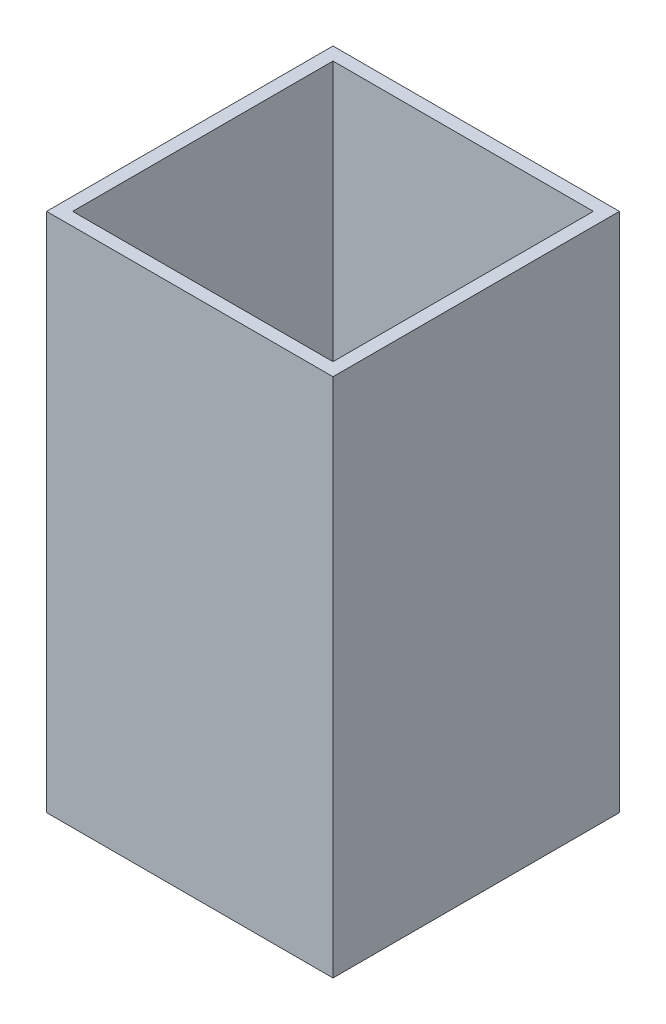
ISO-10303-21;
HEADER;
FILE_DESCRIPTION(('STEP AP214'),'2;1');
FILE_NAME('part.step','',(''),(''),'','','');
FILE_SCHEMA(('AUTOMOTIVE_DESIGN { 1 0 10303 214 1 1 1 1 }'));
ENDSEC;
DATA;
#1=APPLICATION_CONTEXT('core data for automotive mechanical design processes');
#2=APPLICATION_PROTOCOL_DEFINITION('international standard','automotive_design',2000,#1);
#3=PRODUCT_CONTEXT('',#1,'mechanical');
#4=PRODUCT('Part','Part','',(#3));
#5=PRODUCT_RELATED_PRODUCT_CATEGORY('part','',(#4));
#6=PRODUCT_DEFINITION_FORMATION('','',#4);
#7=PRODUCT_DEFINITION_CONTEXT('part definition',#1,'design');
#8=PRODUCT_DEFINITION('design','',#6,#7);
#9=PRODUCT_DEFINITION_SHAPE('','',#8);
#10=(LENGTH_UNIT() NAMED_UNIT(*) SI_UNIT(.MILLI.,.METRE.));
#11=(NAMED_UNIT(*) PLANE_ANGLE_UNIT() SI_UNIT($,.RADIAN.));
#12=(NAMED_UNIT(*) SI_UNIT($,.STERADIAN.) SOLID_ANGLE_UNIT());
#13=UNCERTAINTY_MEASURE_WITH_UNIT(LENGTH_MEASURE(1.E-05),#10,'distance_accuracy_value','');
#14=(GEOMETRIC_REPRESENTATION_CONTEXT(3) GLOBAL_UNCERTAINTY_ASSIGNED_CONTEXT((#13)) GLOBAL_UNIT_ASSIGNED_CONTEXT((#10,
#11,#12)) REPRESENTATION_CONTEXT('',''));
#15=CARTESIAN_POINT('',(0.,0.,0.));
#16=DIRECTION('',(0.,0.,1.));
#17=DIRECTION('',(1.,0.,0.));
#18=AXIS2_PLACEMENT_3D('',#15,#16,#17);
#19=CARTESIAN_POINT('',(-27.5,100.,-27.5));
#20=DIRECTION('',(1.,0.,0.));
#21=DIRECTION('',(0.,0.,-1.));
#22=AXIS2_PLACEMENT_3D('',#19,#20,#21);
#23=PLANE('',#22);
#24=DIRECTION('',(0.,0.,1.));
#25=VECTOR('',#24,1.);
#26=CARTESIAN_POINT('',(-27.5,0.,-27.5));
#27=LINE('',#26,#25);
#28=CARTESIAN_POINT('',(-27.5,0.,-27.5));
#29=VERTEX_POINT('',#28);
#30=CARTESIAN_POINT('',(-27.5,0.,27.5));
#31=VERTEX_POINT('',#30);
#32=EDGE_CURVE('E125',#29,#31,#27,.T.);
#33=ORIENTED_EDGE('',*,*,#32,.T.);
#34=DIRECTION('',(0.,-1.,0.));
#35=VECTOR('',#34,1.);
#36=CARTESIAN_POINT('',(-27.5,100.,27.5));
#37=LINE('',#36,#35);
#38=CARTESIAN_POINT('',(-27.5,100.,27.5));
#39=VERTEX_POINT('',#38);
#40=EDGE_CURVE('E156',#39,#31,#37,.T.);
#41=ORIENTED_EDGE('',*,*,#40,.F.);
#42=DIRECTION('',(0.,0.,1.));
#43=VECTOR('',#42,1.);
#44=CARTESIAN_POINT('',(-27.5,100.,-27.5));
#45=LINE('',#44,#43);
#46=CARTESIAN_POINT('',(-27.5,100.,-27.5));
#47=VERTEX_POINT('',#46);
#48=EDGE_CURVE('E128',#47,#39,#45,.T.);
#49=ORIENTED_EDGE('',*,*,#48,.F.);
#50=DIRECTION('',(0.,-1.,0.));
#51=VECTOR('',#50,1.);
#52=CARTESIAN_POINT('',(-27.5,100.,-27.5));
#53=LINE('',#52,#51);
#54=EDGE_CURVE('E140',#47,#29,#53,.T.);
#55=ORIENTED_EDGE('',*,*,#54,.T.);
#56=EDGE_LOOP('',(#33,#41,#49,#55));
#57=FACE_BOUND('',#56,.T.);
#58=ADVANCED_FACE('F35',(#57),#23,.F.);
#59=CARTESIAN_POINT('',(-27.5,100.,27.5));
#60=DIRECTION('',(0.,0.,-1.));
#61=DIRECTION('',(-1.,0.,0.));
#62=AXIS2_PLACEMENT_3D('',#59,#60,#61);
#63=PLANE('',#62);
#64=DIRECTION('',(1.,0.,0.));
#65=VECTOR('',#64,1.);
#66=CARTESIAN_POINT('',(-27.5,0.,27.5));
#67=LINE('',#66,#65);
#68=CARTESIAN_POINT('',(27.5,0.,27.5));
#69=VERTEX_POINT('',#68);
#70=EDGE_CURVE('E143',#31,#69,#67,.T.);
#71=ORIENTED_EDGE('',*,*,#70,.T.);
#72=DIRECTION('',(0.,-1.,0.));
#73=VECTOR('',#72,1.);
#74=CARTESIAN_POINT('',(27.5,100.,27.5));
#75=LINE('',#74,#73);
#76=CARTESIAN_POINT('',(27.5,100.,27.5));
#77=VERTEX_POINT('',#76);
#78=EDGE_CURVE('E154',#77,#69,#75,.T.);
#79=ORIENTED_EDGE('',*,*,#78,.F.);
#80=DIRECTION('',(1.,0.,0.));
#81=VECTOR('',#80,1.);
#82=CARTESIAN_POINT('',(-27.5,100.,27.5));
#83=LINE('',#82,#81);
#84=EDGE_CURVE('E131',#39,#77,#83,.T.);
#85=ORIENTED_EDGE('',*,*,#84,.F.);
#86=ORIENTED_EDGE('',*,*,#40,.T.);
#87=EDGE_LOOP('',(#71,#79,#85,#86));
#88=FACE_BOUND('',#87,.T.);
#89=ADVANCED_FACE('F180',(#88),#63,.F.);
#90=CARTESIAN_POINT('',(27.5,100.,-27.5));
#91=DIRECTION('',(1.,0.,0.));
#92=DIRECTION('',(0.,0.,-1.));
#93=AXIS2_PLACEMENT_3D('',#90,#91,#92);
#94=PLANE('',#93);
#95=DIRECTION('',(0.,0.,1.));
#96=VECTOR('',#95,1.);
#97=CARTESIAN_POINT('',(27.5,0.,-27.5));
#98=LINE('',#97,#96);
#99=CARTESIAN_POINT('',(27.5,0.,-27.5));
#100=VERTEX_POINT('',#99);
#101=EDGE_CURVE('E146',#100,#69,#98,.T.);
#102=ORIENTED_EDGE('',*,*,#101,.F.);
#103=DIRECTION('',(0.,-1.,0.));
#104=VECTOR('',#103,1.);
#105=CARTESIAN_POINT('',(27.5,100.,-27.5));
#106=LINE('',#105,#104);
#107=CARTESIAN_POINT('',(27.5,100.,-27.5));
#108=VERTEX_POINT('',#107);
#109=EDGE_CURVE('E152',#108,#100,#106,.T.);
#110=ORIENTED_EDGE('',*,*,#109,.F.);
#111=DIRECTION('',(0.,0.,1.));
#112=VECTOR('',#111,1.);
#113=CARTESIAN_POINT('',(27.5,100.,-27.5));
#114=LINE('',#113,#112);
#115=EDGE_CURVE('E134',#108,#77,#114,.T.);
#116=ORIENTED_EDGE('',*,*,#115,.T.);
#117=ORIENTED_EDGE('',*,*,#78,.T.);
#118=EDGE_LOOP('',(#102,#110,#116,#117));
#119=FACE_BOUND('',#118,.T.);
#120=ADVANCED_FACE('F185',(#119),#94,.T.);
#121=CARTESIAN_POINT('',(-27.5,100.,-27.5));
#122=DIRECTION('',(0.,0.,-1.));
#123=DIRECTION('',(-1.,0.,0.));
#124=AXIS2_PLACEMENT_3D('',#121,#122,#123);
#125=PLANE('',#124);
#126=DIRECTION('',(1.,0.,0.));
#127=VECTOR('',#126,1.);
#128=CARTESIAN_POINT('',(-27.5,0.,-27.5));
#129=LINE('',#128,#127);
#130=EDGE_CURVE('E132',#29,#100,#129,.T.);
#131=ORIENTED_EDGE('',*,*,#130,.F.);
#132=ORIENTED_EDGE('',*,*,#54,.F.);
#133=DIRECTION('',(1.,0.,0.));
#134=VECTOR('',#133,1.);
#135=CARTESIAN_POINT('',(-27.5,100.,-27.5));
#136=LINE('',#135,#134);
#137=EDGE_CURVE('E137',#47,#108,#136,.T.);
#138=ORIENTED_EDGE('',*,*,#137,.T.);
#139=ORIENTED_EDGE('',*,*,#109,.T.);
#140=EDGE_LOOP('',(#131,#132,#138,#139));
#141=FACE_BOUND('',#140,.T.);
#142=ADVANCED_FACE('F192',(#141),#125,.T.);
#143=CARTESIAN_POINT('',(0.,100.,0.));
#144=DIRECTION('',(0.,1.,0.));
#145=DIRECTION('',(0.,0.,1.));
#146=AXIS2_PLACEMENT_3D('',#143,#144,#145);
#147=PLANE('',#146);
#148=DIRECTION('',(0.,0.,-1.));
#149=VECTOR('',#148,1.);
#150=CARTESIAN_POINT('',(25.,100.,-25.));
#151=LINE('',#150,#149);
#152=CARTESIAN_POINT('',(25.,100.,25.));
#153=VERTEX_POINT('',#152);
#154=CARTESIAN_POINT('',(25.,100.,-25.));
#155=VERTEX_POINT('',#154);
#156=EDGE_CURVE('E49',#153,#155,#151,.T.);
#157=ORIENTED_EDGE('',*,*,#156,.F.);
#158=DIRECTION('',(1.,0.,0.));
#159=VECTOR('',#158,1.);
#160=CARTESIAN_POINT('',(-25.,100.,25.));
#161=LINE('',#160,#159);
#162=CARTESIAN_POINT('',(-25.,100.,25.));
#163=VERTEX_POINT('',#162);
#164=EDGE_CURVE('E118',#163,#153,#161,.T.);
#165=ORIENTED_EDGE('',*,*,#164,.F.);
#166=DIRECTION('',(0.,0.,1.));
#167=VECTOR('',#166,1.);
#168=CARTESIAN_POINT('',(-25.,100.,-25.));
#169=LINE('',#168,#167);
#170=CARTESIAN_POINT('',(-25.,100.,-25.));
#171=VERTEX_POINT('',#170);
#172=EDGE_CURVE('E102',#171,#163,#169,.T.);
#173=ORIENTED_EDGE('',*,*,#172,.F.);
#174=DIRECTION('',(-1.,0.,0.));
#175=VECTOR('',#174,1.);
#176=CARTESIAN_POINT('',(-25.,100.,-25.));
#177=LINE('',#176,#175);
#178=EDGE_CURVE('E111',#155,#171,#177,.T.);
#179=ORIENTED_EDGE('',*,*,#178,.F.);
#180=EDGE_LOOP('',(#157,#165,#173,#179));
#181=FACE_BOUND('',#180,.T.);
#182=ORIENTED_EDGE('',*,*,#48,.T.);
#183=ORIENTED_EDGE('',*,*,#84,.T.);
#184=ORIENTED_EDGE('',*,*,#115,.F.);
#185=ORIENTED_EDGE('',*,*,#137,.F.);
#186=EDGE_LOOP('',(#182,#183,#184,#185));
#187=FACE_BOUND('',#186,.T.);
#188=ADVANCED_FACE('F115',(#181,#187),#147,.T.);
#189=CARTESIAN_POINT('',(0.,0.,0.));
#190=DIRECTION('',(0.,1.,0.));
#191=DIRECTION('',(0.,0.,1.));
#192=AXIS2_PLACEMENT_3D('',#189,#190,#191);
#193=PLANE('',#192);
#194=DIRECTION('',(1.,0.,0.));
#195=VECTOR('',#194,1.);
#196=CARTESIAN_POINT('',(0.,0.,25.));
#197=LINE('',#196,#195);
#198=CARTESIAN_POINT('',(-25.,0.,25.));
#199=VERTEX_POINT('',#198);
#200=CARTESIAN_POINT('',(25.,0.,25.));
#201=VERTEX_POINT('',#200);
#202=EDGE_CURVE('E42',#199,#201,#197,.T.);
#203=ORIENTED_EDGE('',*,*,#202,.T.);
#204=DIRECTION('',(0.,0.,-1.));
#205=VECTOR('',#204,1.);
#206=CARTESIAN_POINT('',(25.,0.,0.));
#207=LINE('',#206,#205);
#208=CARTESIAN_POINT('',(25.,0.,-25.));
#209=VERTEX_POINT('',#208);
#210=EDGE_CURVE('E11',#201,#209,#207,.T.);
#211=ORIENTED_EDGE('',*,*,#210,.T.);
#212=DIRECTION('',(-1.,0.,0.));
#213=VECTOR('',#212,1.);
#214=CARTESIAN_POINT('',(0.,0.,-25.));
#215=LINE('',#214,#213);
#216=CARTESIAN_POINT('',(-25.,0.,-25.));
#217=VERTEX_POINT('',#216);
#218=EDGE_CURVE('E159',#209,#217,#215,.T.);
#219=ORIENTED_EDGE('',*,*,#218,.T.);
#220=DIRECTION('',(0.,0.,1.));
#221=VECTOR('',#220,1.);
#222=CARTESIAN_POINT('',(-25.,0.,0.));
#223=LINE('',#222,#221);
#224=EDGE_CURVE('E105',#217,#199,#223,.T.);
#225=ORIENTED_EDGE('',*,*,#224,.T.);
#226=EDGE_LOOP('',(#203,#211,#219,#225));
#227=FACE_BOUND('',#226,.T.);
#228=ORIENTED_EDGE('',*,*,#32,.F.);
#229=ORIENTED_EDGE('',*,*,#130,.T.);
#230=ORIENTED_EDGE('',*,*,#101,.T.);
#231=ORIENTED_EDGE('',*,*,#70,.F.);
#232=EDGE_LOOP('',(#228,#229,#230,#231));
#233=FACE_BOUND('',#232,.T.);
#234=ADVANCED_FACE('F163',(#227,#233),#193,.F.);
#235=CARTESIAN_POINT('',(25.,-1.2E-05,-25.));
#236=DIRECTION('',(1.,0.,0.));
#237=DIRECTION('',(0.,0.,-1.));
#238=AXIS2_PLACEMENT_3D('',#235,#236,#237);
#239=PLANE('',#238);
#240=DIRECTION('',(0.,1.,0.));
#241=VECTOR('',#240,1.);
#242=CARTESIAN_POINT('',(25.,-1.2E-05,25.));
#243=LINE('',#242,#241);
#244=EDGE_CURVE('E123',#201,#153,#243,.T.);
#245=ORIENTED_EDGE('',*,*,#244,.T.);
#246=ORIENTED_EDGE('',*,*,#156,.T.);
#247=DIRECTION('',(0.,1.,0.));
#248=VECTOR('',#247,1.);
#249=CARTESIAN_POINT('',(25.,-1.2E-05,-25.));
#250=LINE('',#249,#248);
#251=EDGE_CURVE('E108',#209,#155,#250,.T.);
#252=ORIENTED_EDGE('',*,*,#251,.F.);
#253=ORIENTED_EDGE('',*,*,#210,.F.);
#254=EDGE_LOOP('',(#245,#246,#252,#253));
#255=FACE_BOUND('',#254,.T.);
#256=ADVANCED_FACE('F168',(#255),#239,.F.);
#257=CARTESIAN_POINT('',(-25.,-1.2E-05,25.));
#258=DIRECTION('',(0.,0.,1.));
#259=DIRECTION('',(1.,0.,0.));
#260=AXIS2_PLACEMENT_3D('',#257,#258,#259);
#261=PLANE('',#260);
#262=DIRECTION('',(0.,1.,0.));
#263=VECTOR('',#262,1.);
#264=CARTESIAN_POINT('',(-25.,-1.2E-05,25.));
#265=LINE('',#264,#263);
#266=EDGE_CURVE('E107',#199,#163,#265,.T.);
#267=ORIENTED_EDGE('',*,*,#266,.T.);
#268=ORIENTED_EDGE('',*,*,#164,.T.);
#269=ORIENTED_EDGE('',*,*,#244,.F.);
#270=ORIENTED_EDGE('',*,*,#202,.F.);
#271=EDGE_LOOP('',(#267,#268,#269,#270));
#272=FACE_BOUND('',#271,.T.);
#273=ADVANCED_FACE('F167',(#272),#261,.F.);
#274=CARTESIAN_POINT('',(-25.,-1.2E-05,-25.));
#275=DIRECTION('',(-1.,0.,0.));
#276=DIRECTION('',(0.,0.,1.));
#277=AXIS2_PLACEMENT_3D('',#274,#275,#276);
#278=PLANE('',#277);
#279=DIRECTION('',(0.,1.,0.));
#280=VECTOR('',#279,1.);
#281=CARTESIAN_POINT('',(-25.,-1.2E-05,-25.));
#282=LINE('',#281,#280);
#283=EDGE_CURVE('E57',#217,#171,#282,.T.);
#284=ORIENTED_EDGE('',*,*,#283,.T.);
#285=ORIENTED_EDGE('',*,*,#172,.T.);
#286=ORIENTED_EDGE('',*,*,#266,.F.);
#287=ORIENTED_EDGE('',*,*,#224,.F.);
#288=EDGE_LOOP('',(#284,#285,#286,#287));
#289=FACE_BOUND('',#288,.T.);
#290=ADVANCED_FACE('F99',(#289),#278,.F.);
#291=CARTESIAN_POINT('',(-25.,-1.2E-05,-25.));
#292=DIRECTION('',(0.,0.,-1.));
#293=DIRECTION('',(-1.,0.,0.));
#294=AXIS2_PLACEMENT_3D('',#291,#292,#293);
#295=PLANE('',#294);
#296=ORIENTED_EDGE('',*,*,#251,.T.);
#297=ORIENTED_EDGE('',*,*,#178,.T.);
#298=ORIENTED_EDGE('',*,*,#283,.F.);
#299=ORIENTED_EDGE('',*,*,#218,.F.);
#300=EDGE_LOOP('',(#296,#297,#298,#299));
#301=FACE_BOUND('',#300,.T.);
#302=ADVANCED_FACE('F112',(#301),#295,.F.);
#303=CLOSED_SHELL('',(#58,#89,#120,#142,#188,#234,#256,#273,#290,#302));
#304=MANIFOLD_SOLID_BREP('B2',#303);
#305=ADVANCED_BREP_SHAPE_REPRESENTATION('',(#18,#304),#14);
#306=SHAPE_DEFINITION_REPRESENTATION(#9,#305);
ENDSEC;
END-ISO-10303-21;
